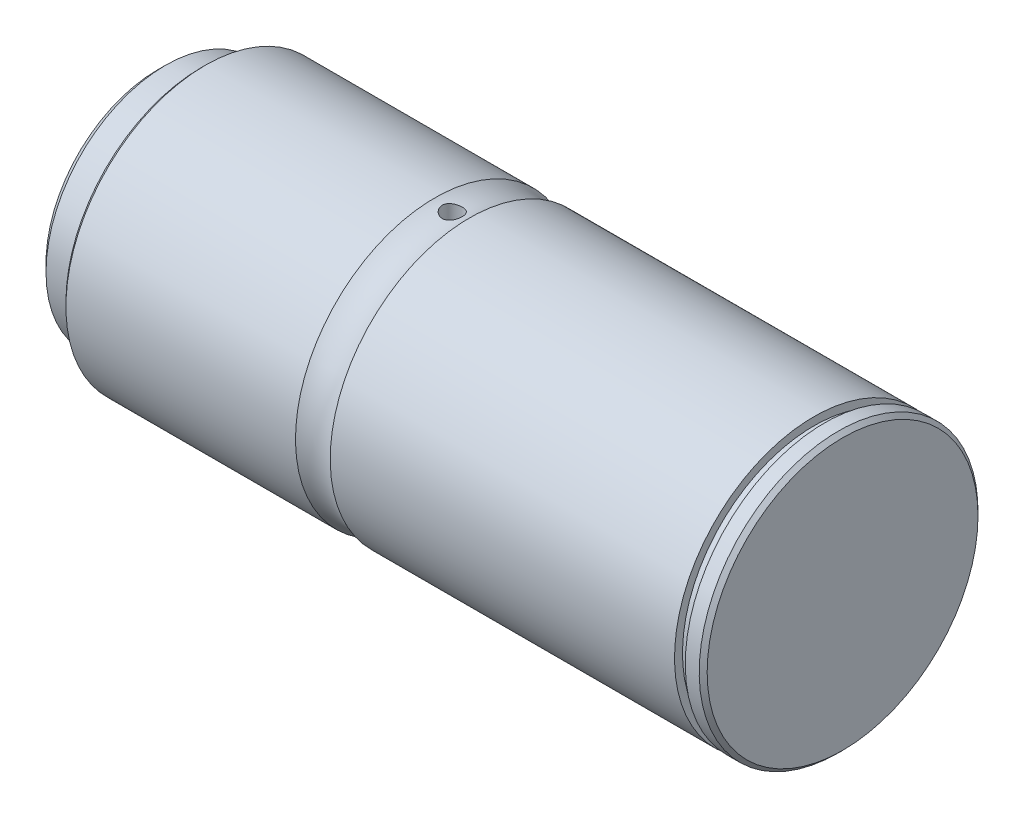
ISO-10303-21;
HEADER;
FILE_DESCRIPTION(('STEP AP214'),'2;1');
FILE_NAME('part.step','',(''),(''),'','','');
FILE_SCHEMA(('AUTOMOTIVE_DESIGN { 1 0 10303 214 1 1 1 1 }'));
ENDSEC;
DATA;
#1=APPLICATION_CONTEXT('core data for automotive mechanical design processes');
#2=APPLICATION_PROTOCOL_DEFINITION('international standard','automotive_design',2000,#1);
#3=PRODUCT_CONTEXT('',#1,'mechanical');
#4=PRODUCT('Part','Part','',(#3));
#5=PRODUCT_RELATED_PRODUCT_CATEGORY('part','',(#4));
#6=PRODUCT_DEFINITION_FORMATION('','',#4);
#7=PRODUCT_DEFINITION_CONTEXT('part definition',#1,'design');
#8=PRODUCT_DEFINITION('design','',#6,#7);
#9=PRODUCT_DEFINITION_SHAPE('','',#8);
#10=(LENGTH_UNIT() NAMED_UNIT(*) SI_UNIT(.MILLI.,.METRE.));
#11=(NAMED_UNIT(*) PLANE_ANGLE_UNIT() SI_UNIT($,.RADIAN.));
#12=(NAMED_UNIT(*) SI_UNIT($,.STERADIAN.) SOLID_ANGLE_UNIT());
#13=UNCERTAINTY_MEASURE_WITH_UNIT(LENGTH_MEASURE(1.E-05),#10,'distance_accuracy_value','');
#14=(GEOMETRIC_REPRESENTATION_CONTEXT(3) GLOBAL_UNCERTAINTY_ASSIGNED_CONTEXT((#13)) GLOBAL_UNIT_ASSIGNED_CONTEXT((#10,
#11,#12)) REPRESENTATION_CONTEXT('',''));
#15=CARTESIAN_POINT('',(0.,0.,0.));
#16=DIRECTION('',(0.,0.,1.));
#17=DIRECTION('',(1.,0.,0.));
#18=AXIS2_PLACEMENT_3D('',#15,#16,#17);
#19=CARTESIAN_POINT('',(74.,-50.,0.));
#20=DIRECTION('',(0.,1.,0.));
#21=DIRECTION('',(0.,0.,1.));
#22=AXIS2_PLACEMENT_3D('',#19,#20,#21);
#23=CYLINDRICAL_SURFACE('',#22,2.5);
#24=CARTESIAN_POINT('',(74.,-3.12249899919919,2.5));
#25=CARTESIAN_POINT('',(74.0621567514455,-3.1224999155542,2.49999941097139));
#26=CARTESIAN_POINT('',(74.1243259466708,-3.12436490733916,2.49767581942173));
#27=CARTESIAN_POINT('',(74.2481171795477,-3.13172923119025,2.48843349840856));
#28=CARTESIAN_POINT('',(74.3097388732571,-3.13723070381363,2.48151206248433));
#29=CARTESIAN_POINT('',(74.4932260477437,-3.15888953558504,2.45397595058365));
#30=CARTESIAN_POINT('',(74.6135483311889,-3.18020036271141,2.42658990946459));
#31=CARTESIAN_POINT('',(74.8455981978782,-3.23299770760366,2.35576217141197));
#32=CARTESIAN_POINT('',(74.957390415055,-3.26439575383208,2.31245961359202));
#33=CARTESIAN_POINT('',(75.172008525334,-3.33366000884438,2.21143916430899));
#34=CARTESIAN_POINT('',(75.274834173753,-3.37152639405533,2.15372087963018));
#35=CARTESIAN_POINT('',(75.4837339813036,-3.45559225121875,2.01647682425577));
#36=CARTESIAN_POINT('',(75.5883933250045,-3.50222814511577,1.93506425666948));
#37=CARTESIAN_POINT('',(75.7837615516238,-3.59505503533366,1.75662526657431));
#38=CARTESIAN_POINT('',(75.8744582799536,-3.64124561158437,1.65958538899782));
#39=CARTESIAN_POINT('',(76.0502202981726,-3.73459524771313,1.43833990582854));
#40=CARTESIAN_POINT('',(76.1332861844504,-3.78119887781503,1.31226934259652));
#41=CARTESIAN_POINT('',(76.2405451547362,-3.84307251838773,1.11163395543429));
#42=CARTESIAN_POINT('',(76.2734151383331,-3.8623628309205,1.04281240974104));
#43=CARTESIAN_POINT('',(76.3329546853632,-3.89770436975435,0.901758767615552));
#44=CARTESIAN_POINT('',(76.3596285310384,-3.91375783207116,0.829529068393799));
#45=CARTESIAN_POINT('',(76.4039838152562,-3.94066759113822,0.689700297916579));
#46=CARTESIAN_POINT('',(76.4223019765181,-3.95188535984465,0.622371981278594));
#47=CARTESIAN_POINT('',(76.4533022863133,-3.9709624190916,0.485997575898815));
#48=CARTESIAN_POINT('',(76.4659876892162,-3.9788236487972,0.416952503441689));
#49=CARTESIAN_POINT('',(76.4855137976345,-3.99095470334736,0.27776544985718));
#50=CARTESIAN_POINT('',(76.4923581165134,-3.99522674847833,0.207624174243912));
#51=CARTESIAN_POINT('',(76.5000992133892,-4.00006125072436,0.0669114466599455));
#52=CARTESIAN_POINT('',(76.5009966759633,-4.00062413482247,-0.0036599548602722));
#53=CARTESIAN_POINT('',(76.4952746264527,-3.99704479619502,-0.19604508155553));
#54=CARTESIAN_POINT('',(76.4826934969211,-3.98917040897435,-0.317681845488527));
#55=CARTESIAN_POINT('',(76.4402697820338,-3.9629090327593,-0.556636494620246));
#56=CARTESIAN_POINT('',(76.4104258920263,-3.94452124920476,-0.673954052677418));
#57=CARTESIAN_POINT('',(76.3347914407167,-3.89876170711608,-0.90177199176386));
#58=CARTESIAN_POINT('',(76.2889600804289,-3.87136697381046,-1.01225407159606));
#59=CARTESIAN_POINT('',(76.1830627610157,-3.80971291751353,-1.22404012071222));
#60=CARTESIAN_POINT('',(76.1229935589363,-3.77545203089317,-1.32534199174244));
#61=CARTESIAN_POINT('',(75.9819435830763,-3.69786441247166,-1.52942649744658));
#62=CARTESIAN_POINT('',(75.8992907233095,-3.6539400638152,-1.63082454612906));
#63=CARTESIAN_POINT('',(75.7197352627929,-3.56390927740506,-1.81919733573061));
#64=CARTESIAN_POINT('',(75.622811953616,-3.51779973570408,-1.90615071842623));
#65=CARTESIAN_POINT('',(75.4025887468265,-3.42142883464465,-2.07470887167908));
#66=CARTESIAN_POINT('',(75.2774972366419,-3.37141162686596,-2.15413229677843));
#67=CARTESIAN_POINT('',(75.0127077626986,-3.28028278192381,-2.29052307550563));
#68=CARTESIAN_POINT('',(74.8730373125469,-3.2391548038693,-2.34753179448503));
#69=CARTESIAN_POINT('',(74.6204611938937,-3.18183753131762,-2.42437133527931));
#70=CARTESIAN_POINT('',(74.5101780747865,-3.16193408602512,-2.45003683445404));
#71=CARTESIAN_POINT('',(74.2857696224401,-3.13358277759546,-2.4862033707309));
#72=CARTESIAN_POINT('',(74.1716497573431,-3.12511926504438,-2.49672512520811));
#73=CARTESIAN_POINT('',(73.9425426394975,-3.12092267030676,-2.5019707209518));
#74=CARTESIAN_POINT('',(73.8275539995215,-3.12521876170184,-2.49665835896694));
#75=CARTESIAN_POINT('',(73.6004388356815,-3.14592085836187,-2.47051466367814));
#76=CARTESIAN_POINT('',(73.4883147616288,-3.16233689222905,-2.44967047849126));
#77=CARTESIAN_POINT('',(73.2715632405743,-3.20460120797142,-2.39409874195038));
#78=CARTESIAN_POINT('',(73.1668426841056,-3.23028954367816,-2.35960571424757));
#79=CARTESIAN_POINT('',(72.9644253001062,-3.28831148388748,-2.27804893702243));
#80=CARTESIAN_POINT('',(72.866730981122,-3.3206474460208,-2.23098072583746));
#81=CARTESIAN_POINT('',(72.6613880583368,-3.39574401285202,-2.11530798730694));
#82=CARTESIAN_POINT('',(72.5553854726982,-3.43931724293014,-2.04430931160544));
#83=CARTESIAN_POINT('',(72.3556293393457,-3.52787943213337,-1.8873786892149));
#84=CARTESIAN_POINT('',(72.2618886787576,-3.57286982004466,-1.8014312490262));
#85=CARTESIAN_POINT('',(72.074035929359,-3.66766209459503,-1.60076932492121));
#86=CARTESIAN_POINT('',(71.9822726015151,-3.71707933883199,-1.48365201617177));
#87=CARTESIAN_POINT('',(71.8198529852802,-3.80768973398605,-1.2325678740781));
#88=CARTESIAN_POINT('',(71.749186804873,-3.84888673619007,-1.09860897940974));
#89=CARTESIAN_POINT('',(71.663418932025,-3.89988966499775,-0.891930804655093));
#90=CARTESIAN_POINT('',(71.6387025560487,-3.91477055097244,-0.824318196039432));
#91=CARTESIAN_POINT('',(71.5950617232677,-3.94124643918617,-0.686640792876433));
#92=CARTESIAN_POINT('',(71.576133913849,-3.95284334314804,-0.616577444051145));
#93=CARTESIAN_POINT('',(71.5443941698607,-3.97238512039949,-0.474639231464273));
#94=CARTESIAN_POINT('',(71.5315769004835,-3.98033317908835,-0.402766005755517));
#95=CARTESIAN_POINT('',(71.5122608277071,-3.99234168343342,-0.25788180714247));
#96=CARTESIAN_POINT('',(71.5057609790692,-3.99640277220023,-0.184871024482543));
#97=CARTESIAN_POINT('',(71.4969284844928,-4.00191521492705,0.0131102774248857));
#98=CARTESIAN_POINT('',(71.5007342070905,-3.99952706123946,0.138539079205443));
#99=CARTESIAN_POINT('',(71.5269175895455,-3.98321975018362,0.386583137102124));
#100=CARTESIAN_POINT('',(71.5492944066788,-3.96930111604856,0.509198520626822));
#101=CARTESIAN_POINT('',(71.6103224155461,-3.93192083384284,0.74408060548384));
#102=CARTESIAN_POINT('',(71.6483820735646,-3.90880701054802,0.8565587526318));
#103=CARTESIAN_POINT('',(71.7391194624434,-3.85489971248843,1.07343034721916));
#104=CARTESIAN_POINT('',(71.7917996595672,-3.82410494215308,1.17782242685801));
#105=CARTESIAN_POINT('',(71.9163212787199,-3.75350673935648,1.38731297754796));
#106=CARTESIAN_POINT('',(71.9895839907574,-3.71310001864656,1.49136012183779));
#107=CARTESIAN_POINT('',(72.1501532325141,-3.62867283985205,1.68643334934802));
#108=CARTESIAN_POINT('',(72.2374756088342,-3.58464833191202,1.7774445184368));
#109=CARTESIAN_POINT('',(72.4382325150618,-3.49000828219718,1.95744716561588));
#110=CARTESIAN_POINT('',(72.5536166125714,-3.43935738427103,2.04425661250062));
#111=CARTESIAN_POINT('',(72.7992894097597,-3.34349647457111,2.19754648509903));
#112=CARTESIAN_POINT('',(72.9295698111525,-3.29828346204189,2.26403815415027));
#113=CARTESIAN_POINT('',(73.1728053007848,-3.2285953978009,2.36198229412839));
#114=CARTESIAN_POINT('',(73.2832705721535,-3.20174639338769,2.39792458576828));
#115=CARTESIAN_POINT('',(73.5099393430017,-3.15878358104509,2.45425618419745));
#116=CARTESIAN_POINT('',(73.6261234197996,-3.14263581150428,2.47469472410167));
#117=CARTESIAN_POINT('',(73.786059994646,-3.12952857640606,2.49119847139521));
#118=CARTESIAN_POINT('',(73.8287255257086,-3.12689994306769,2.49449433837959));
#119=CARTESIAN_POINT('',(73.9142586989517,-3.12338461939861,2.49889558125806));
#120=CARTESIAN_POINT('',(73.9571263892433,-3.1224983671287,2.50000040629187));
#121=CARTESIAN_POINT('',(74.,-3.12249899919919,2.5));
#122=B_SPLINE_CURVE_WITH_KNOTS('',3,(#24,#25,#26,#27,#28,#29,#30,#31,#32,#33,#34,#35,#36,#37,
#38,#39,#40,#41,#42,#43,#44,#45,#46,#47,#48,#49,#50,#51,#52,#53,#54,#55,#56,#57,#58,#59,#60,#61,
#62,#63,#64,#65,#66,#67,#68,#69,#70,#71,#72,#73,#74,#75,#76,#77,#78,#79,#80,#81,#82,#83,#84,#85,
#86,#87,#88,#89,#90,#91,#92,#93,#94,#95,#96,#97,#98,#99,#100,#101,#102,#103,#104,#105,#106,#107,
#108,#109,#110,#111,#112,#113,#114,#115,#116,#117,#118,#119,#120,#121),.UNSPECIFIED.,.T.,.F.,(4,
2,2,2,2,2,2,2,2,2,2,2,2,2,2,2,2,2,2,2,2,2,2,2,2,2,2,2,2,2,2,2,2,2,2,2,2,2,2,2,2,2,2,2,2,2,2,2,
4),(0.,0.186415315858463,0.372940459994501,0.746478880764682,1.11682668423131,1.48718459072605,
1.9072279868507,2.32763499192879,2.79876029265969,3.03445880867313,3.26999394209508,
3.48170145743204,3.69328649746502,3.90474055342594,4.11617026725865,4.48184709708112,
4.84755156693917,5.21419620193003,5.58092442797433,5.99329080205305,6.40626158573463,
6.87316206383503,7.33919680735484,7.68265621505465,8.02564530559507,8.36941921026405,
8.71347788865088,9.05186495232122,9.39037223519198,9.79332737765185,10.1967026751544,
10.6647326786671,11.1325428866818,11.3527929661038,11.5729152387446,11.7928449800804,
12.0127383271001,12.3871595324234,12.7615637480925,13.1229788842094,13.4844550226785,
13.8834503840958,14.2828986410983,14.7399238503459,15.1966956936286,15.5530255473291,
15.9082190611886,16.0367696833384,16.1653526209168),.UNSPECIFIED.);
#123=CARTESIAN_POINT('',(74.,-3.12249899919919,2.5));
#124=VERTEX_POINT('',#123);
#125=EDGE_CURVE('E63',#124,#124,#122,.T.);
#126=ORIENTED_EDGE('',*,*,#125,.T.);
#127=EDGE_LOOP('',(#126));
#128=FACE_BOUND('',#127,.T.);
#129=CARTESIAN_POINT('',(71.940823442995,-34.1849235210543,-1.41767129726223));
#130=CARTESIAN_POINT('',(71.8634431418228,-34.2058805826897,-1.30527551884677));
#131=CARTESIAN_POINT('',(71.7951687295469,-34.225580796723,-1.18637508336717));
#132=CARTESIAN_POINT('',(71.678786699352,-34.2603220332909,-0.938459156775375));
#133=CARTESIAN_POINT('',(71.6306727859005,-34.2753645099168,-0.809446838268316));
#134=CARTESIAN_POINT('',(71.5561194983671,-34.2990838193437,-0.54444810997248));
#135=CARTESIAN_POINT('',(71.5297214943115,-34.3077484987955,-0.408448910781098));
#136=CARTESIAN_POINT('',(71.4997570804134,-34.3176059329933,-0.133691996290922));
#137=CARTESIAN_POINT('',(71.4961873586292,-34.318799771613,0.00506531592882345));
#138=CARTESIAN_POINT('',(71.5117801846965,-34.3136480270609,0.277117960326861));
#139=CARTESIAN_POINT('',(71.5302907774816,-34.3075186641582,0.410455481200277));
#140=CARTESIAN_POINT('',(71.5882872329639,-34.2887943794797,0.672004384500487));
#141=CARTESIAN_POINT('',(71.6277748044661,-34.2761989309731,0.800215348397945));
#142=CARTESIAN_POINT('',(71.7268171084698,-34.2458237412776,1.04915885339694));
#143=CARTESIAN_POINT('',(71.7865303531189,-34.2280032031401,1.16982311533729));
#144=CARTESIAN_POINT('',(71.9242145447561,-34.1891201729517,1.39966918357731));
#145=CARTESIAN_POINT('',(72.0021901413643,-34.1680568557534,1.508848055405));
#146=CARTESIAN_POINT('',(72.1784212752687,-34.1238318897247,1.71796283590963));
#147=CARTESIAN_POINT('',(72.2774463528336,-34.1006182676198,1.81724010023527));
#148=CARTESIAN_POINT('',(72.4908638422821,-34.0555020460948,1.99801624839782));
#149=CARTESIAN_POINT('',(72.6052584249177,-34.0335996324995,2.07951261662972));
#150=CARTESIAN_POINT('',(72.8485134457488,-33.9931814580314,2.22359405666598));
#151=CARTESIAN_POINT('',(72.9775755791976,-33.9747253116531,2.28585662691007));
#152=CARTESIAN_POINT('',(73.2450635968843,-33.9438082609082,2.38757771105095));
#153=CARTESIAN_POINT('',(73.383486546089,-33.9313454872023,2.42704333611327));
#154=CARTESIAN_POINT('',(73.6602152644457,-33.9142586904159,2.48065700856463));
#155=CARTESIAN_POINT('',(73.7983306198943,-33.9093581386343,2.49569929471694));
#156=CARTESIAN_POINT('',(74.0751933348262,-33.9070881264317,2.50270083063866));
#157=CARTESIAN_POINT('',(74.2139405656136,-33.9097171954049,2.49466458786083));
#158=CARTESIAN_POINT('',(74.4834391642696,-33.9219897105237,2.45646463898645));
#159=CARTESIAN_POINT('',(74.6143041823496,-33.9314048919099,2.42702074782228));
#160=CARTESIAN_POINT('',(74.8691654986107,-33.9559750628083,2.34784236090644));
#161=CARTESIAN_POINT('',(74.9931610152722,-33.9711307038621,2.29810556186185));
#162=CARTESIAN_POINT('',(75.2337188039265,-34.0059800813899,2.17861358306927));
#163=CARTESIAN_POINT('',(75.3500686467133,-34.0257629422873,2.10845761616215));
#164=CARTESIAN_POINT('',(75.5696552771735,-34.0676366836764,1.9505092738151));
#165=CARTESIAN_POINT('',(75.6728884222917,-34.0897282022002,1.86271201672171));
#166=CARTESIAN_POINT('',(75.8680346827009,-34.1349516448623,1.66742935474684));
#167=CARTESIAN_POINT('',(75.9592543622214,-34.1580867763191,1.5592502950632));
#168=CARTESIAN_POINT('',(76.1223685192125,-34.2018576747393,1.32871692318024));
#169=CARTESIAN_POINT('',(76.1942622681476,-34.2224933474637,1.20636207684077));
#170=CARTESIAN_POINT('',(76.3166699365536,-34.2589057951675,0.950369407165823));
#171=CARTESIAN_POINT('',(76.3671401441917,-34.2746726182372,0.816709176376441));
#172=CARTESIAN_POINT('',(76.4446633506037,-34.2993289786515,0.54216798516539));
#173=CARTESIAN_POINT('',(76.4717251692881,-34.3082211061383,0.401289765578736));
#174=CARTESIAN_POINT('',(76.5007073169468,-34.3177621926055,0.123072162795667));
#175=CARTESIAN_POINT('',(76.5036959731273,-34.3187613866967,-0.01414448652062));
#176=CARTESIAN_POINT('',(76.4872233029296,-34.3133185731213,-0.287061059030863));
#177=CARTESIAN_POINT('',(76.467764209684,-34.3068773056419,-0.42276113174004));
#178=CARTESIAN_POINT('',(76.4077866805146,-34.2875412512105,-0.685846797856871));
#179=CARTESIAN_POINT('',(76.3677261515809,-34.2747870047359,-0.813347983397815));
#180=CARTESIAN_POINT('',(76.2681239326774,-34.2443075153071,-1.05985622313542));
#181=CARTESIAN_POINT('',(76.2085786740258,-34.2265813618194,-1.1788617164552));
#182=CARTESIAN_POINT('',(76.0693066251063,-34.1873351903808,-1.40951974393985));
#183=CARTESIAN_POINT('',(75.9889507135088,-34.165704786156,-1.5207733310437));
#184=CARTESIAN_POINT('',(75.8112763513427,-34.1213930895067,-1.72857649009956));
#185=CARTESIAN_POINT('',(75.7139534042133,-34.0987115196776,-1.82512215145279));
#186=CARTESIAN_POINT('',(75.5006091772281,-34.0537972185015,-2.0045795112492));
#187=CARTESIAN_POINT('',(75.3840102382058,-34.0316157863691,-2.08681937050215));
#188=CARTESIAN_POINT('',(75.1380129974923,-33.9911656633744,-2.23051763283554));
#189=CARTESIAN_POINT('',(75.0086161293808,-33.9728965349933,-2.29197836012236));
#190=CARTESIAN_POINT('',(74.7425705422559,-33.9426335190746,-2.39132708901445));
#191=CARTESIAN_POINT('',(74.6060582430336,-33.9305503722955,-2.42955197402147));
#192=CARTESIAN_POINT('',(74.3281144273815,-33.9136968587466,-2.48240501191707));
#193=CARTESIAN_POINT('',(74.1866845492948,-33.9089240798779,-2.49704094820124));
#194=CARTESIAN_POINT('',(73.9096427109963,-33.9073030455006,-2.50203493132806));
#195=CARTESIAN_POINT('',(73.7740504710854,-33.9101132126627,-2.49343942107739));
#196=CARTESIAN_POINT('',(73.5063652234926,-33.9226153538975,-2.45450949008857));
#197=CARTESIAN_POINT('',(73.3742720816567,-33.9323070637374,-2.42417590403454));
#198=CARTESIAN_POINT('',(73.1179825335964,-33.957432616114,-2.34307743431935));
#199=CARTESIAN_POINT('',(72.9937444458723,-33.972832529826,-2.29243313198174));
#200=CARTESIAN_POINT('',(72.7553809544655,-34.0077776478469,-2.17226882271116));
#201=CARTESIAN_POINT('',(72.6412589340029,-34.0273242316083,-2.10274253223689));
#202=CARTESIAN_POINT('',(72.4183512403466,-34.0700288144433,-1.94128899467672));
#203=CARTESIAN_POINT('',(72.3104715813844,-34.0933426985463,-1.84815046372673));
#204=CARTESIAN_POINT('',(72.1120368424968,-34.139867445949,-1.6449218262739));
#205=CARTESIAN_POINT('',(72.0214831142175,-34.1630783010733,-1.53483039843472));
#206=CARTESIAN_POINT('',(71.940823442995,-34.1849235210543,-1.41767129726223));
#207=B_SPLINE_CURVE_WITH_KNOTS('',3,(#129,#130,#131,#132,#133,#134,#135,#136,#137,#138,#139,
#140,#141,#142,#143,#144,#145,#146,#147,#148,#149,#150,#151,#152,#153,#154,#155,#156,#157,#158,
#159,#160,#161,#162,#163,#164,#165,#166,#167,#168,#169,#170,#171,#172,#173,#174,#175,#176,#177,
#178,#179,#180,#181,#182,#183,#184,#185,#186,#187,#188,#189,#190,#191,#192,#193,#194,#195,#196,
#197,#198,#199,#200,#201,#202,#203,#204,#205,#206),.UNSPECIFIED.,.T.,.F.,(4,2,2,2,2,2,2,2,2,2,2,
2,2,2,2,2,2,2,2,2,2,2,2,2,2,2,2,2,2,2,2,2,2,2,2,2,2,2,4),(0.,0.413695098707151,0.82726091611782,
1.24161278691581,1.6559045419164,2.05826052745796,2.46064929433504,2.86626756660566,
3.27198922232986,3.69642548093478,4.12092174903602,4.55219136707334,4.98332638426558,
5.39828751052621,5.81316759650623,6.21470726234715,6.61629251657141,7.02636338168082,
7.43654787722964,7.86468982876647,8.29284791783648,8.72187545453353,9.15074126994388,
9.56046368553082,9.97014534489181,10.3710911534707,10.7721104375168,11.1870580863652,
11.6021158712234,12.0332287097164,12.4642933110179,12.8889490328172,13.3134646067582,
13.7191805084427,14.1248808325539,14.5282074166542,14.9316683844452,15.3628622184306,
15.7940896773912),.UNSPECIFIED.);
#208=CARTESIAN_POINT('',(71.940823442995,-34.1849235210543,-1.41767129726223));
#209=VERTEX_POINT('',#208);
#210=EDGE_CURVE('E81',#209,#209,#207,.T.);
#211=ORIENTED_EDGE('',*,*,#210,.F.);
#212=EDGE_LOOP('',(#211));
#213=FACE_BOUND('',#212,.T.);
#214=ADVANCED_FACE('F38',(#128,#213),#23,.F.);
#215=CARTESIAN_POINT('',(0.,0.,0.));
#216=DIRECTION('',(1.,0.,0.));
#217=DIRECTION('',(0.,1.,0.));
#218=AXIS2_PLACEMENT_3D('',#215,#216,#217);
#219=PLANE('',#218);
#220=CARTESIAN_POINT('',(0.,0.,0.));
#221=DIRECTION('',(-1.,0.,0.));
#222=DIRECTION('',(0.,-1.,0.));
#223=AXIS2_PLACEMENT_3D('',#220,#221,#222);
#224=CIRCLE('',#223,15.);
#225=CARTESIAN_POINT('',(0.,-15.,0.));
#226=VERTEX_POINT('',#225);
#227=EDGE_CURVE('E74',#226,#226,#224,.T.);
#228=ORIENTED_EDGE('',*,*,#227,.F.);
#229=EDGE_LOOP('',(#228));
#230=FACE_BOUND('',#229,.T.);
#231=CARTESIAN_POINT('',(0.,0.,0.));
#232=DIRECTION('',(1.,0.,0.));
#233=DIRECTION('',(0.,1.,0.));
#234=AXIS2_PLACEMENT_3D('',#231,#232,#233);
#235=CIRCLE('',#234,28.);
#236=CARTESIAN_POINT('',(0.,28.,0.));
#237=VERTEX_POINT('',#236);
#238=EDGE_CURVE('E99',#237,#237,#235,.F.);
#239=ORIENTED_EDGE('',*,*,#238,.T.);
#240=EDGE_LOOP('',(#239));
#241=FACE_BOUND('',#240,.T.);
#242=ADVANCED_FACE('F153',(#230,#241),#219,.F.);
#243=CARTESIAN_POINT('',(172.,35.,0.));
#244=DIRECTION('',(-1.,0.,0.));
#245=DIRECTION('',(0.,-1.,0.));
#246=AXIS2_PLACEMENT_3D('',#243,#244,#245);
#247=PLANE('',#246);
#248=CARTESIAN_POINT('',(172.,0.,0.));
#249=DIRECTION('',(-1.,0.,0.));
#250=DIRECTION('',(0.,-1.,0.));
#251=AXIS2_PLACEMENT_3D('',#248,#249,#250);
#252=CIRCLE('',#251,33.9999999999999);
#253=CARTESIAN_POINT('',(172.,-33.9999999999999,0.));
#254=VERTEX_POINT('',#253);
#255=EDGE_CURVE('E11',#254,#254,#252,.F.);
#256=ORIENTED_EDGE('',*,*,#255,.T.);
#257=EDGE_LOOP('',(#256));
#258=FACE_BOUND('',#257,.T.);
#259=ADVANCED_FACE('F158',(#258),#247,.F.);
#260=CARTESIAN_POINT('',(0.,0.,0.));
#261=DIRECTION('',(-1.,0.,0.));
#262=DIRECTION('',(0.,-1.,0.));
#263=AXIS2_PLACEMENT_3D('',#260,#261,#262);
#264=CYLINDRICAL_SURFACE('',#263,35.);
#265=CARTESIAN_POINT('',(171.,0.,0.));
#266=DIRECTION('',(-1.,0.,0.));
#267=DIRECTION('',(0.,-1.,0.));
#268=AXIS2_PLACEMENT_3D('',#265,#266,#267);
#269=CIRCLE('',#268,35.);
#270=CARTESIAN_POINT('',(171.,-35.,0.));
#271=VERTEX_POINT('',#270);
#272=EDGE_CURVE('E46',#271,#271,#269,.T.);
#273=ORIENTED_EDGE('',*,*,#272,.T.);
#274=EDGE_LOOP('',(#273));
#275=FACE_BOUND('',#274,.T.);
#276=CARTESIAN_POINT('',(167.5,0.,0.));
#277=DIRECTION('',(-1.,0.,0.));
#278=DIRECTION('',(0.,-1.,0.));
#279=AXIS2_PLACEMENT_3D('',#276,#277,#278);
#280=CIRCLE('',#279,35.);
#281=CARTESIAN_POINT('',(167.5,-35.,0.));
#282=VERTEX_POINT('',#281);
#283=EDGE_CURVE('E96',#282,#282,#280,.T.);
#284=ORIENTED_EDGE('',*,*,#283,.F.);
#285=EDGE_LOOP('',(#284));
#286=FACE_BOUND('',#285,.T.);
#287=ADVANCED_FACE('F196',(#275,#286),#264,.T.);
#288=CARTESIAN_POINT('',(167.5,33.,0.));
#289=DIRECTION('',(1.,0.,0.));
#290=DIRECTION('',(0.,1.,0.));
#291=AXIS2_PLACEMENT_3D('',#288,#289,#290);
#292=PLANE('',#291);
#293=CARTESIAN_POINT('',(167.5,0.,0.));
#294=DIRECTION('',(-1.,0.,0.));
#295=DIRECTION('',(0.,-1.,0.));
#296=AXIS2_PLACEMENT_3D('',#293,#294,#295);
#297=CIRCLE('',#296,33.);
#298=CARTESIAN_POINT('',(167.5,-33.,0.));
#299=VERTEX_POINT('',#298);
#300=EDGE_CURVE('E93',#299,#299,#297,.T.);
#301=ORIENTED_EDGE('',*,*,#300,.F.);
#302=EDGE_LOOP('',(#301));
#303=FACE_BOUND('',#302,.T.);
#304=ORIENTED_EDGE('',*,*,#283,.T.);
#305=EDGE_LOOP('',(#304));
#306=FACE_BOUND('',#305,.T.);
#307=ADVANCED_FACE('F190',(#303,#306),#292,.F.);
#308=CARTESIAN_POINT('',(0.,0.,0.));
#309=DIRECTION('',(-1.,0.,0.));
#310=DIRECTION('',(0.,-1.,0.));
#311=AXIS2_PLACEMENT_3D('',#308,#309,#310);
#312=CYLINDRICAL_SURFACE('',#311,33.);
#313=CARTESIAN_POINT('',(164.8,0.,0.));
#314=DIRECTION('',(-1.,0.,0.));
#315=DIRECTION('',(0.,-1.,0.));
#316=AXIS2_PLACEMENT_3D('',#313,#314,#315);
#317=CIRCLE('',#316,33.);
#318=CARTESIAN_POINT('',(164.8,-33.,0.));
#319=VERTEX_POINT('',#318);
#320=EDGE_CURVE('E90',#319,#319,#317,.T.);
#321=ORIENTED_EDGE('',*,*,#320,.F.);
#322=EDGE_LOOP('',(#321));
#323=FACE_BOUND('',#322,.T.);
#324=ORIENTED_EDGE('',*,*,#300,.T.);
#325=EDGE_LOOP('',(#324));
#326=FACE_BOUND('',#325,.T.);
#327=ADVANCED_FACE('F184',(#323,#326),#312,.T.);
#328=CARTESIAN_POINT('',(164.8,35.,0.));
#329=DIRECTION('',(-1.,0.,0.));
#330=DIRECTION('',(0.,-1.,0.));
#331=AXIS2_PLACEMENT_3D('',#328,#329,#330);
#332=PLANE('',#331);
#333=CARTESIAN_POINT('',(164.8,0.,0.));
#334=DIRECTION('',(-1.,0.,0.));
#335=DIRECTION('',(0.,-1.,0.));
#336=AXIS2_PLACEMENT_3D('',#333,#334,#335);
#337=CIRCLE('',#336,35.);
#338=CARTESIAN_POINT('',(164.8,-35.,0.));
#339=VERTEX_POINT('',#338);
#340=EDGE_CURVE('E87',#339,#339,#337,.T.);
#341=ORIENTED_EDGE('',*,*,#340,.F.);
#342=EDGE_LOOP('',(#341));
#343=FACE_BOUND('',#342,.T.);
#344=ORIENTED_EDGE('',*,*,#320,.T.);
#345=EDGE_LOOP('',(#344));
#346=FACE_BOUND('',#345,.T.);
#347=ADVANCED_FACE('F179',(#343,#346),#332,.F.);
#348=CARTESIAN_POINT('',(0.,0.,0.));
#349=DIRECTION('',(-1.,0.,0.));
#350=DIRECTION('',(0.,-1.,0.));
#351=AXIS2_PLACEMENT_3D('',#348,#349,#350);
#352=CYLINDRICAL_SURFACE('',#351,35.);
#353=CARTESIAN_POINT('',(78.3588989435407,0.,0.));
#354=DIRECTION('',(-1.,0.,0.));
#355=DIRECTION('',(0.,-1.,0.));
#356=AXIS2_PLACEMENT_3D('',#353,#354,#355);
#357=CIRCLE('',#356,35.);
#358=CARTESIAN_POINT('',(78.3588989435407,-35.,0.));
#359=VERTEX_POINT('',#358);
#360=EDGE_CURVE('E84',#359,#359,#357,.T.);
#361=ORIENTED_EDGE('',*,*,#360,.F.);
#362=EDGE_LOOP('',(#361));
#363=FACE_BOUND('',#362,.T.);
#364=ORIENTED_EDGE('',*,*,#340,.T.);
#365=EDGE_LOOP('',(#364));
#366=FACE_BOUND('',#365,.T.);
#367=ADVANCED_FACE('F170',(#363,#366),#352,.T.);
#368=CARTESIAN_POINT('',(74.,0.,0.));
#369=DIRECTION('',(-1.,0.,0.));
#370=DIRECTION('',(0.,-1.,0.));
#371=AXIS2_PLACEMENT_3D('',#368,#369,#370);
#372=TOROIDAL_SURFACE('',#371,44.,10.);
#373=ORIENTED_EDGE('',*,*,#210,.T.);
#374=EDGE_LOOP('',(#373));
#375=FACE_BOUND('',#374,.T.);
#376=CARTESIAN_POINT('',(71.940823442995,34.1849235210543,-1.41767129726223));
#377=CARTESIAN_POINT('',(72.0211798620094,34.1631603397487,-1.5343868189071));
#378=CARTESIAN_POINT('',(72.1113683078781,34.1400391645456,-1.64410617796501));
#379=CARTESIAN_POINT('',(72.3089872419927,34.09367593114,-1.84675984926389));
#380=CARTESIAN_POINT('',(72.4164247029696,34.0704338277456,-1.93968734114448));
#381=CARTESIAN_POINT('',(72.6459034045639,34.0263992721853,-2.10630868616117));
#382=CARTESIAN_POINT('',(72.7679555993135,34.0056086809516,-2.17998797898744));
#383=CARTESIAN_POINT('',(73.0233835725031,33.968870695687,-2.30574689445653));
#384=CARTESIAN_POINT('',(73.1567556176152,33.952921712757,-2.35783360532014));
#385=CARTESIAN_POINT('',(73.4280485698717,33.9280273438572,-2.43770918195832));
#386=CARTESIAN_POINT('',(73.5658072522708,33.9189370564819,-2.46600229774831));
#387=CARTESIAN_POINT('',(73.8443947404553,33.9082766885858,-2.49908967689252));
#388=CARTESIAN_POINT('',(73.9852227668942,33.9067047209066,-2.50388983717371));
#389=CARTESIAN_POINT('',(74.2597788665864,33.9111689253825,-2.49010721424452));
#390=CARTESIAN_POINT('',(74.3935610990445,33.9168954587869,-2.47247613076226));
#391=CARTESIAN_POINT('',(74.6561383122281,33.934792555662,-2.41609535243374));
#392=CARTESIAN_POINT('',(74.7849330941834,33.9469633756809,-2.37734481681658));
#393=CARTESIAN_POINT('',(75.0348958021837,33.9765384725749,-2.27971686630455));
#394=CARTESIAN_POINT('',(75.1560126409639,33.9939740940063,-2.22071860888457));
#395=CARTESIAN_POINT('',(75.3868493334818,34.0322485418232,-2.08437755543112));
#396=CARTESIAN_POINT('',(75.4965663365382,34.0530882161027,-2.00703018675681));
#397=CARTESIAN_POINT('',(75.7066364509525,34.0970359676166,-1.83217890524096));
#398=CARTESIAN_POINT('',(75.8063629309884,34.120203559101,-1.73393630120202));
#399=CARTESIAN_POINT('',(75.9881757624129,34.1654766835579,-1.52205450122883));
#400=CARTESIAN_POINT('',(76.0702591601427,34.1875820382192,-1.40841273247787));
#401=CARTESIAN_POINT('',(76.2158497268305,34.2286530405853,-1.16632547673098));
#402=CARTESIAN_POINT('',(76.2789896591602,34.2475538648856,-1.03764723649681));
#403=CARTESIAN_POINT('',(76.3825198134886,34.279415688609,-0.770757985431697));
#404=CARTESIAN_POINT('',(76.4229174071086,34.292378612468,-0.632550079836226));
#405=CARTESIAN_POINT('',(76.4783930557265,34.310369523158,-0.355976055837184));
#406=CARTESIAN_POINT('',(76.4943522496243,34.3156732377948,-0.217804821368707));
#407=CARTESIAN_POINT('',(76.5031359268749,34.3185787150315,0.0593373815264712));
#408=CARTESIAN_POINT('',(76.4959653216858,34.3161821127427,0.19830817391692));
#409=CARTESIAN_POINT('',(76.4594414158698,34.304207199419,0.468000033691487));
#410=CARTESIAN_POINT('',(76.4308707779896,34.2948823690185,0.598839764453346));
#411=CARTESIAN_POINT('',(76.3534629812064,34.2704073141432,0.85379593737937));
#412=CARTESIAN_POINT('',(76.3046232755849,34.2552563576592,0.977911532469401));
#413=CARTESIAN_POINT('',(76.1869219180423,34.2203879756086,1.21891118906826));
#414=CARTESIAN_POINT('',(76.1176522985433,34.2005793587832,1.33558234975508));
#415=CARTESIAN_POINT('',(75.9614313492046,34.1586838756203,1.55597027819434));
#416=CARTESIAN_POINT('',(75.8744751536697,34.1365963831746,1.65968346842063));
#417=CARTESIAN_POINT('',(75.6806971244603,34.0913965431176,1.85610759292309));
#418=CARTESIAN_POINT('',(75.5731548886287,34.0682830082353,1.94810911382445));
#419=CARTESIAN_POINT('',(75.3437518162341,34.0245796166602,2.1128827939561));
#420=CARTESIAN_POINT('',(75.2218905218203,34.0039898407075,2.18565433806747));
#421=CARTESIAN_POINT('',(74.9667702069363,33.9676257115543,2.30987280006529));
#422=CARTESIAN_POINT('',(74.8334912710644,33.951860001087,2.36128150286324));
#423=CARTESIAN_POINT('',(74.5595554993804,33.9270684684117,2.44074106130995));
#424=CARTESIAN_POINT('',(74.4189012561107,33.9180402946226,2.46880006702387));
#425=CARTESIAN_POINT('',(74.1407447063659,33.9080476279662,2.49978465572034));
#426=CARTESIAN_POINT('',(74.003368981201,33.9067514302795,2.50374426921878));
#427=CARTESIAN_POINT('',(73.7299607947085,33.9114829261653,2.48913936577198));
#428=CARTESIAN_POINT('',(73.5939281875182,33.9175098154312,2.47057732241769));
#429=CARTESIAN_POINT('',(73.3300009095777,33.935998184188,2.41225784899017));
#430=CARTESIAN_POINT('',(73.2019950997551,33.9483212337733,2.37295582941961));
#431=CARTESIAN_POINT('',(72.9543787930362,33.9780162059103,2.27473636988479));
#432=CARTESIAN_POINT('',(72.8347696833801,33.9953889603107,2.21581569786458));
#433=CARTESIAN_POINT('',(72.6031528525567,34.0340316958789,2.07787468271558));
#434=CARTESIAN_POINT('',(72.4915095827402,34.0554083659514,1.99827284845766));
#435=CARTESIAN_POINT('',(72.2828194862059,34.099440710967,1.82207360829647));
#436=CARTESIAN_POINT('',(72.1857766935959,34.1220967370265,1.72547152116584));
#437=CARTESIAN_POINT('',(72.0051593861144,34.1672072962255,1.51351905399741));
#438=CARTESIAN_POINT('',(71.9222583405026,34.1896194547613,1.39758410031168));
#439=CARTESIAN_POINT('',(71.7771108391065,34.2307210333075,1.15282264138774));
#440=CARTESIAN_POINT('',(71.7148623628203,34.2494108174174,1.02399739885071));
#441=CARTESIAN_POINT('',(71.6137036361964,34.2806167228076,0.758615203631349));
#442=CARTESIAN_POINT('',(71.5745126562025,34.2932067613909,0.622174387312605));
#443=CARTESIAN_POINT('',(71.5197588987571,34.3109745764564,0.344173600780068));
#444=CARTESIAN_POINT('',(71.5041882638753,34.3161548178133,0.202615348958192));
#445=CARTESIAN_POINT('',(71.4974470278364,34.3183871508172,-0.0745835140276577));
#446=CARTESIAN_POINT('',(71.5051840707473,34.315803142701,-0.210195899288693));
#447=CARTESIAN_POINT('',(71.5424105716619,34.3036021671164,-0.47804909752442));
#448=CARTESIAN_POINT('',(71.571896323095,34.2939863980534,-0.610290481036765));
#449=CARTESIAN_POINT('',(71.6491685521062,34.2695969365295,-0.860030053930722));
#450=CARTESIAN_POINT('',(71.6957542847906,34.2551663399218,-0.977936940428646));
#451=CARTESIAN_POINT('',(71.8059162796053,34.2224889245293,-1.20495845159007));
#452=CARTESIAN_POINT('',(71.8694965888084,34.2042411969619,-1.31407097390569));
#453=CARTESIAN_POINT('',(71.940823442995,34.1849235210543,-1.41767129726223));
#454=B_SPLINE_CURVE_WITH_KNOTS('',3,(#376,#377,#378,#379,#380,#381,#382,#383,#384,#385,#386,
#387,#388,#389,#390,#391,#392,#393,#394,#395,#396,#397,#398,#399,#400,#401,#402,#403,#404,#405,
#406,#407,#408,#409,#410,#411,#412,#413,#414,#415,#416,#417,#418,#419,#420,#421,#422,#423,#424,
#425,#426,#427,#428,#429,#430,#431,#432,#433,#434,#435,#436,#437,#438,#439,#440,#441,#442,#443,
#444,#445,#446,#447,#448,#449,#450,#451,#452,#453),.UNSPECIFIED.,.T.,.F.,(4,2,2,2,2,2,2,2,2,2,2,
2,2,2,2,2,2,2,2,2,2,2,2,2,2,2,2,2,2,2,2,2,2,2,2,2,2,2,4),(0.,0.429636586962088,0.85944728927411,
1.28958218677962,1.71957577139893,2.14020895129932,2.5607365433606,2.96400296569494,
3.36728544334357,3.77301789992311,4.17885157237562,4.60258900931361,5.02639732970929,
5.4579574681978,5.8893776416439,6.30484260474154,6.7202193524421,7.12110397828316,
7.52203898876058,7.93159571017478,8.34126525614566,8.76945631245817,9.19766106387519,
9.62662854914776,10.0554462431357,10.4657270878205,10.8759628747581,11.2775441082155,
11.6791915325456,12.0936581438532,12.5082390626969,12.9390005453205,13.3697198728357,
13.7950803541025,14.2202993059455,14.6259044569138,15.0314404977168,15.4127084052841,
15.7940671886557),.UNSPECIFIED.);
#455=CARTESIAN_POINT('',(71.940823442995,34.1849235210543,-1.41767129726223));
#456=VERTEX_POINT('',#455);
#457=EDGE_CURVE('E73',#456,#456,#454,.T.);
#458=ORIENTED_EDGE('',*,*,#457,.T.);
#459=EDGE_LOOP('',(#458));
#460=FACE_BOUND('',#459,.T.);
#461=CARTESIAN_POINT('',(69.6411010564593,0.,0.));
#462=DIRECTION('',(-1.,0.,0.));
#463=DIRECTION('',(0.,-1.,0.));
#464=AXIS2_PLACEMENT_3D('',#461,#462,#463);
#465=CIRCLE('',#464,35.);
#466=CARTESIAN_POINT('',(69.6411010564593,-35.,0.));
#467=VERTEX_POINT('',#466);
#468=EDGE_CURVE('E80',#467,#467,#465,.T.);
#469=ORIENTED_EDGE('',*,*,#468,.F.);
#470=EDGE_LOOP('',(#469));
#471=FACE_BOUND('',#470,.T.);
#472=ORIENTED_EDGE('',*,*,#360,.T.);
#473=EDGE_LOOP('',(#472));
#474=FACE_BOUND('',#473,.T.);
#475=ADVANCED_FACE('F111',(#375,#460,#471,#474),#372,.F.);
#476=CARTESIAN_POINT('',(0.,0.,0.));
#477=DIRECTION('',(-1.,0.,0.));
#478=DIRECTION('',(0.,-1.,0.));
#479=AXIS2_PLACEMENT_3D('',#476,#477,#478);
#480=CYLINDRICAL_SURFACE('',#479,35.);
#481=CARTESIAN_POINT('',(12.,0.,0.));
#482=DIRECTION('',(1.,0.,0.));
#483=DIRECTION('',(0.,1.,0.));
#484=AXIS2_PLACEMENT_3D('',#481,#482,#483);
#485=CIRCLE('',#484,35.);
#486=CARTESIAN_POINT('',(12.,35.,0.));
#487=VERTEX_POINT('',#486);
#488=EDGE_CURVE('E222',#487,#487,#485,.T.);
#489=ORIENTED_EDGE('',*,*,#488,.T.);
#490=EDGE_LOOP('',(#489));
#491=FACE_BOUND('',#490,.T.);
#492=ORIENTED_EDGE('',*,*,#468,.T.);
#493=EDGE_LOOP('',(#492));
#494=FACE_BOUND('',#493,.T.);
#495=ADVANCED_FACE('F169',(#491,#494),#480,.T.);
#496=CARTESIAN_POINT('',(11.,30.,0.));
#497=DIRECTION('',(1.,0.,0.));
#498=DIRECTION('',(0.,1.,0.));
#499=AXIS2_PLACEMENT_3D('',#496,#497,#498);
#500=PLANE('',#499);
#501=CARTESIAN_POINT('',(11.,0.,0.));
#502=DIRECTION('',(1.,0.,0.));
#503=DIRECTION('',(0.,1.,0.));
#504=AXIS2_PLACEMENT_3D('',#501,#502,#503);
#505=CIRCLE('',#504,34.);
#506=CARTESIAN_POINT('',(11.,34.,0.));
#507=VERTEX_POINT('',#506);
#508=EDGE_CURVE('E225',#507,#507,#505,.F.);
#509=ORIENTED_EDGE('',*,*,#508,.T.);
#510=EDGE_LOOP('',(#509));
#511=FACE_BOUND('',#510,.T.);
#512=CARTESIAN_POINT('',(11.,0.,0.));
#513=DIRECTION('',(-1.,0.,0.));
#514=DIRECTION('',(0.,-1.,0.));
#515=AXIS2_PLACEMENT_3D('',#512,#513,#514);
#516=CIRCLE('',#515,30.);
#517=CARTESIAN_POINT('',(11.,-30.,0.));
#518=VERTEX_POINT('',#517);
#519=EDGE_CURVE('E77',#518,#518,#516,.T.);
#520=ORIENTED_EDGE('',*,*,#519,.F.);
#521=EDGE_LOOP('',(#520));
#522=FACE_BOUND('',#521,.T.);
#523=ADVANCED_FACE('F242',(#511,#522),#500,.F.);
#524=CARTESIAN_POINT('',(0.,0.,0.));
#525=DIRECTION('',(-1.,0.,0.));
#526=DIRECTION('',(0.,-1.,0.));
#527=AXIS2_PLACEMENT_3D('',#524,#525,#526);
#528=CYLINDRICAL_SURFACE('',#527,30.);
#529=CARTESIAN_POINT('',(1.99999999999998,0.,0.));
#530=DIRECTION('',(1.,0.,0.));
#531=DIRECTION('',(0.,1.,0.));
#532=AXIS2_PLACEMENT_3D('',#529,#530,#531);
#533=CIRCLE('',#532,30.);
#534=CARTESIAN_POINT('',(1.99999999999997,30.,0.));
#535=VERTEX_POINT('',#534);
#536=EDGE_CURVE('E227',#535,#535,#533,.T.);
#537=ORIENTED_EDGE('',*,*,#536,.T.);
#538=EDGE_LOOP('',(#537));
#539=FACE_BOUND('',#538,.T.);
#540=ORIENTED_EDGE('',*,*,#519,.T.);
#541=EDGE_LOOP('',(#540));
#542=FACE_BOUND('',#541,.T.);
#543=ADVANCED_FACE('F121',(#539,#542),#528,.T.);
#544=CARTESIAN_POINT('',(74.,3.12249899919919,2.5));
#545=CARTESIAN_POINT('',(73.9378432485544,3.1224999155542,2.49999941097139));
#546=CARTESIAN_POINT('',(73.8756740533292,3.12436490733916,2.49767581942173));
#547=CARTESIAN_POINT('',(73.7518828204522,3.13172923119025,2.48843349840856));
#548=CARTESIAN_POINT('',(73.6902611267428,3.13723070381364,2.48151206248433));
#549=CARTESIAN_POINT('',(73.5067739522562,3.15888953558504,2.45397595058365));
#550=CARTESIAN_POINT('',(73.386451668811,3.18020036271142,2.42658990946459));
#551=CARTESIAN_POINT('',(73.1544018021217,3.23299770760367,2.35576217141197));
#552=CARTESIAN_POINT('',(73.0426095849449,3.26439575383208,2.31245961359201));
#553=CARTESIAN_POINT('',(72.8279914746659,3.33366000884439,2.21143916430898));
#554=CARTESIAN_POINT('',(72.7251658262469,3.37152639405533,2.15372087963017));
#555=CARTESIAN_POINT('',(72.5162660186963,3.45559225121875,2.01647682425578));
#556=CARTESIAN_POINT('',(72.4116066749954,3.50222814511577,1.93506425666948));
#557=CARTESIAN_POINT('',(72.2162384483762,3.59505503533367,1.75662526657431));
#558=CARTESIAN_POINT('',(72.1255417200463,3.64124561158437,1.65958538899782));
#559=CARTESIAN_POINT('',(71.9497797018273,3.73459524771313,1.43833990582854));
#560=CARTESIAN_POINT('',(71.8667138155495,3.78119887781504,1.31226934259652));
#561=CARTESIAN_POINT('',(71.7594548452637,3.84307251838773,1.11163395543429));
#562=CARTESIAN_POINT('',(71.7265848616669,3.86236283092051,1.04281240974104));
#563=CARTESIAN_POINT('',(71.6670453146367,3.89770436975435,0.901758767615552));
#564=CARTESIAN_POINT('',(71.6403714689615,3.91375783207117,0.829529068393799));
#565=CARTESIAN_POINT('',(71.5960161847437,3.94066759113822,0.689700297916578));
#566=CARTESIAN_POINT('',(71.5776980234818,3.95188535984465,0.622371981278592));
#567=CARTESIAN_POINT('',(71.5466977136866,3.97096241909161,0.485997575898813));
#568=CARTESIAN_POINT('',(71.5340123107837,3.9788236487972,0.416952503441688));
#569=CARTESIAN_POINT('',(71.5144862023654,3.99095470334736,0.27776544985718));
#570=CARTESIAN_POINT('',(71.5076418834865,3.99522674847833,0.207624174243912));
#571=CARTESIAN_POINT('',(71.4999007866107,4.00006125072437,0.0669114466599459));
#572=CARTESIAN_POINT('',(71.4990033240366,4.00062413482248,-0.00365995486027153));
#573=CARTESIAN_POINT('',(71.5047253735472,3.99704479619502,-0.196045081555529));
#574=CARTESIAN_POINT('',(71.5173065030788,3.98917040897435,-0.317681845488526));
#575=CARTESIAN_POINT('',(71.5597302179661,3.9629090327593,-0.556636494620246));
#576=CARTESIAN_POINT('',(71.5895741079736,3.94452124920477,-0.673954052677418));
#577=CARTESIAN_POINT('',(71.6652085592832,3.89876170711608,-0.901771991763859));
#578=CARTESIAN_POINT('',(71.711039919571,3.87136697381046,-1.01225407159606));
#579=CARTESIAN_POINT('',(71.8169372389843,3.80971291751353,-1.22404012071222));
#580=CARTESIAN_POINT('',(71.8770064410636,3.77545203089318,-1.32534199174244));
#581=CARTESIAN_POINT('',(72.0180564169236,3.69786441247166,-1.52942649744658));
#582=CARTESIAN_POINT('',(72.1007092766904,3.6539400638152,-1.63082454612906));
#583=CARTESIAN_POINT('',(72.280264737207,3.56390927740506,-1.81919733573061));
#584=CARTESIAN_POINT('',(72.3771880463839,3.51779973570409,-1.90615071842623));
#585=CARTESIAN_POINT('',(72.5974112531734,3.42142883464466,-2.07470887167908));
#586=CARTESIAN_POINT('',(72.722502763358,3.37141162686596,-2.15413229677843));
#587=CARTESIAN_POINT('',(72.9872922373014,3.28028278192382,-2.29052307550563));
#588=CARTESIAN_POINT('',(73.1269626874531,3.2391548038693,-2.34753179448503));
#589=CARTESIAN_POINT('',(73.3795388061062,3.18183753131763,-2.42437133527931));
#590=CARTESIAN_POINT('',(73.4898219252134,3.16193408602512,-2.45003683445404));
#591=CARTESIAN_POINT('',(73.7142303775598,3.13358277759546,-2.4862033707309));
#592=CARTESIAN_POINT('',(73.8283502426568,3.12511926504438,-2.49672512520811));
#593=CARTESIAN_POINT('',(74.0574573605024,3.12092267030676,-2.5019707209518));
#594=CARTESIAN_POINT('',(74.1724460004784,3.12521876170185,-2.49665835896694));
#595=CARTESIAN_POINT('',(74.3995611643184,3.14592085836187,-2.47051466367814));
#596=CARTESIAN_POINT('',(74.5116852383711,3.16233689222905,-2.44967047849126));
#597=CARTESIAN_POINT('',(74.7284367594256,3.20460120797142,-2.39409874195038));
#598=CARTESIAN_POINT('',(74.8331573158943,3.23028954367816,-2.35960571424757));
#599=CARTESIAN_POINT('',(75.0355746998937,3.28831148388748,-2.27804893702243));
#600=CARTESIAN_POINT('',(75.1332690188779,3.3206474460208,-2.23098072583746));
#601=CARTESIAN_POINT('',(75.3386119416631,3.39574401285202,-2.11530798730694));
#602=CARTESIAN_POINT('',(75.4446145273017,3.43931724293014,-2.04430931160544));
#603=CARTESIAN_POINT('',(75.6443706606542,3.52787943213337,-1.8873786892149));
#604=CARTESIAN_POINT('',(75.7381113212423,3.57286982004466,-1.8014312490262));
#605=CARTESIAN_POINT('',(75.9259640706409,3.66766209459503,-1.60076932492121));
#606=CARTESIAN_POINT('',(76.0177273984849,3.717079338832,-1.48365201617177));
#607=CARTESIAN_POINT('',(76.1801470147197,3.80768973398605,-1.2325678740781));
#608=CARTESIAN_POINT('',(76.2508131951269,3.84888673619008,-1.09860897940974));
#609=CARTESIAN_POINT('',(76.3365810679749,3.89988966499775,-0.891930804655093));
#610=CARTESIAN_POINT('',(76.3612974439512,3.91477055097244,-0.824318196039432));
#611=CARTESIAN_POINT('',(76.4049382767322,3.94124643918617,-0.686640792876435));
#612=CARTESIAN_POINT('',(76.4238660861509,3.95284334314804,-0.616577444051146));
#613=CARTESIAN_POINT('',(76.4556058301392,3.97238512039949,-0.474639231464273));
#614=CARTESIAN_POINT('',(76.4684230995164,3.98033317908835,-0.402766005755518));
#615=CARTESIAN_POINT('',(76.4877391722928,3.99234168343342,-0.257881807142471));
#616=CARTESIAN_POINT('',(76.4942390209307,3.99640277220023,-0.184871024482543));
#617=CARTESIAN_POINT('',(76.5030715155071,4.00191521492705,0.0131102774248852));
#618=CARTESIAN_POINT('',(76.4992657929094,3.99952706123946,0.138539079205442));
#619=CARTESIAN_POINT('',(76.4730824104544,3.98321975018362,0.386583137102123));
#620=CARTESIAN_POINT('',(76.4507055933211,3.96930111604856,0.509198520626822));
#621=CARTESIAN_POINT('',(76.3896775844538,3.93192083384284,0.744080605483839));
#622=CARTESIAN_POINT('',(76.3516179264353,3.90880701054802,0.8565587526318));
#623=CARTESIAN_POINT('',(76.2608805375565,3.85489971248843,1.07343034721916));
#624=CARTESIAN_POINT('',(76.2082003404328,3.82410494215308,1.17782242685801));
#625=CARTESIAN_POINT('',(76.08367872128,3.75350673935648,1.38731297754796));
#626=CARTESIAN_POINT('',(76.0104160092425,3.71310001864657,1.49136012183778));
#627=CARTESIAN_POINT('',(75.8498467674859,3.62867283985205,1.68643334934801));
#628=CARTESIAN_POINT('',(75.7625243911657,3.58464833191203,1.77744451843679));
#629=CARTESIAN_POINT('',(75.5617674849381,3.49000828219718,1.95744716561588));
#630=CARTESIAN_POINT('',(75.4463833874285,3.43935738427103,2.04425661250062));
#631=CARTESIAN_POINT('',(75.2007105902402,3.34349647457111,2.19754648509903));
#632=CARTESIAN_POINT('',(75.0704301888474,3.2982834620419,2.26403815415027));
#633=CARTESIAN_POINT('',(74.8271946992151,3.22859539780091,2.36198229412839));
#634=CARTESIAN_POINT('',(74.7167294278464,3.20174639338769,2.39792458576828));
#635=CARTESIAN_POINT('',(74.4900606569982,3.15878358104509,2.45425618419745));
#636=CARTESIAN_POINT('',(74.3738765802003,3.14263581150428,2.47469472410167));
#637=CARTESIAN_POINT('',(74.2139400053539,3.12952857640606,2.49119847139521));
#638=CARTESIAN_POINT('',(74.1712744742913,3.12689994306769,2.49449433837959));
#639=CARTESIAN_POINT('',(74.0857413010482,3.12338461939861,2.49889558125806));
#640=CARTESIAN_POINT('',(74.0428736107566,3.1224983671287,2.50000040629187));
#641=CARTESIAN_POINT('',(74.,3.12249899919919,2.5));
#642=B_SPLINE_CURVE_WITH_KNOTS('',3,(#544,#545,#546,#547,#548,#549,#550,#551,#552,#553,#554,
#555,#556,#557,#558,#559,#560,#561,#562,#563,#564,#565,#566,#567,#568,#569,#570,#571,#572,#573,
#574,#575,#576,#577,#578,#579,#580,#581,#582,#583,#584,#585,#586,#587,#588,#589,#590,#591,#592,
#593,#594,#595,#596,#597,#598,#599,#600,#601,#602,#603,#604,#605,#606,#607,#608,#609,#610,#611,
#612,#613,#614,#615,#616,#617,#618,#619,#620,#621,#622,#623,#624,#625,#626,#627,#628,#629,#630,
#631,#632,#633,#634,#635,#636,#637,#638,#639,#640,#641),.UNSPECIFIED.,.T.,.F.,(4,2,2,2,2,2,2,2,
2,2,2,2,2,2,2,2,2,2,2,2,2,2,2,2,2,2,2,2,2,2,2,2,2,2,2,2,2,2,2,2,2,2,2,2,2,2,2,2,4),(0.,
0.186415315858463,0.372940459994501,0.746478880764682,1.11682668423132,1.48718459072605,
1.9072279868507,2.32763499192879,2.79876029265969,3.03445880867313,3.26999394209508,
3.48170145743205,3.69328649746502,3.90474055342594,4.11617026725865,4.48184709708112,
4.84755156693917,5.21419620193003,5.58092442797433,5.99329080205305,6.40626158573463,
6.87316206383503,7.33919680735485,7.68265621505465,8.02564530559507,8.36941921026407,
8.71347788865088,9.05186495232122,9.39037223519198,9.79332737765185,10.1967026751544,
10.6647326786671,11.1325428866818,11.3527929661038,11.5729152387446,11.7928449800804,
12.0127383271001,12.3871595324234,12.7615637480925,13.1229788842094,13.4844550226785,
13.8834503840958,14.2828986410983,14.7399238503459,15.1966956936286,15.5530255473291,
15.9082190611886,16.0367696833384,16.1653526209168),.UNSPECIFIED.);
#643=CARTESIAN_POINT('',(74.,3.12249899919919,2.5));
#644=VERTEX_POINT('',#643);
#645=EDGE_CURVE('E60',#644,#644,#642,.T.);
#646=ORIENTED_EDGE('',*,*,#645,.T.);
#647=EDGE_LOOP('',(#646));
#648=FACE_BOUND('',#647,.T.);
#649=ORIENTED_EDGE('',*,*,#457,.F.);
#650=EDGE_LOOP('',(#649));
#651=FACE_BOUND('',#650,.T.);
#652=ADVANCED_FACE('F115',(#648,#651),#23,.F.);
#653=CARTESIAN_POINT('',(0.,0.,0.));
#654=DIRECTION('',(1.,0.,0.));
#655=DIRECTION('',(0.,1.,0.));
#656=AXIS2_PLACEMENT_3D('',#653,#654,#655);
#657=CONICAL_SURFACE('',#656,28.,0.78539816339745);
#658=ORIENTED_EDGE('',*,*,#536,.F.);
#659=EDGE_LOOP('',(#658));
#660=FACE_BOUND('',#659,.T.);
#661=ORIENTED_EDGE('',*,*,#238,.F.);
#662=EDGE_LOOP('',(#661));
#663=FACE_BOUND('',#662,.T.);
#664=ADVANCED_FACE('F120',(#660,#663),#657,.T.);
#665=CARTESIAN_POINT('',(11.,0.,0.));
#666=DIRECTION('',(1.,0.,0.));
#667=DIRECTION('',(0.,1.,0.));
#668=AXIS2_PLACEMENT_3D('',#665,#666,#667);
#669=CONICAL_SURFACE('',#668,34.,0.785398163397455);
#670=ORIENTED_EDGE('',*,*,#488,.F.);
#671=EDGE_LOOP('',(#670));
#672=FACE_BOUND('',#671,.T.);
#673=ORIENTED_EDGE('',*,*,#508,.F.);
#674=EDGE_LOOP('',(#673));
#675=FACE_BOUND('',#674,.T.);
#676=ADVANCED_FACE('F211',(#672,#675),#669,.T.);
#677=CARTESIAN_POINT('',(171.,0.,0.));
#678=DIRECTION('',(-1.,0.,0.));
#679=DIRECTION('',(0.,-1.,0.));
#680=AXIS2_PLACEMENT_3D('',#677,#678,#679);
#681=CONICAL_SURFACE('',#680,35.,0.785398163397459);
#682=ORIENTED_EDGE('',*,*,#255,.F.);
#683=EDGE_LOOP('',(#682));
#684=FACE_BOUND('',#683,.T.);
#685=ORIENTED_EDGE('',*,*,#272,.F.);
#686=EDGE_LOOP('',(#685));
#687=FACE_BOUND('',#686,.T.);
#688=ADVANCED_FACE('F40',(#684,#687),#681,.T.);
#689=CARTESIAN_POINT('',(10.,0.,0.));
#690=DIRECTION('',(-1.,0.,0.));
#691=DIRECTION('',(0.,-1.,0.));
#692=AXIS2_PLACEMENT_3D('',#689,#690,#691);
#693=CYLINDRICAL_SURFACE('',#692,15.);
#694=CARTESIAN_POINT('',(10.,0.,0.));
#695=DIRECTION('',(-1.,0.,0.));
#696=DIRECTION('',(0.,-1.,0.));
#697=AXIS2_PLACEMENT_3D('',#694,#695,#696);
#698=CIRCLE('',#697,15.);
#699=CARTESIAN_POINT('',(10.,-15.,0.));
#700=VERTEX_POINT('',#699);
#701=EDGE_CURVE('E70',#700,#700,#698,.T.);
#702=ORIENTED_EDGE('',*,*,#701,.F.);
#703=EDGE_LOOP('',(#702));
#704=FACE_BOUND('',#703,.T.);
#705=ORIENTED_EDGE('',*,*,#227,.T.);
#706=EDGE_LOOP('',(#705));
#707=FACE_BOUND('',#706,.T.);
#708=ADVANCED_FACE('F123',(#704,#707),#693,.F.);
#709=CARTESIAN_POINT('',(10.,0.,0.));
#710=DIRECTION('',(-1.,0.,0.));
#711=DIRECTION('',(0.,-1.,0.));
#712=AXIS2_PLACEMENT_3D('',#709,#710,#711);
#713=PLANE('',#712);
#714=CARTESIAN_POINT('',(10.,0.,0.));
#715=DIRECTION('',(-1.,0.,0.));
#716=DIRECTION('',(0.,0.,1.));
#717=AXIS2_PLACEMENT_3D('',#714,#715,#716);
#718=CIRCLE('',#717,4.5);
#719=CARTESIAN_POINT('',(10.,0.,4.5));
#720=VERTEX_POINT('',#719);
#721=EDGE_CURVE('E371',#720,#720,#718,.T.);
#722=ORIENTED_EDGE('',*,*,#721,.F.);
#723=EDGE_LOOP('',(#722));
#724=FACE_BOUND('',#723,.T.);
#725=ORIENTED_EDGE('',*,*,#701,.T.);
#726=EDGE_LOOP('',(#725));
#727=FACE_BOUND('',#726,.T.);
#728=ADVANCED_FACE('F140',(#724,#727),#713,.T.);
#729=CARTESIAN_POINT('',(10.,0.,0.));
#730=DIRECTION('',(-1.,0.,0.));
#731=DIRECTION('',(0.,0.,1.));
#732=AXIS2_PLACEMENT_3D('',#729,#730,#731);
#733=CYLINDRICAL_SURFACE('',#732,3.99999999999999);
#734=CARTESIAN_POINT('',(30.3004303095138,0.,0.));
#735=DIRECTION('',(-1.,0.,0.));
#736=DIRECTION('',(0.,0.,1.));
#737=AXIS2_PLACEMENT_3D('',#734,#735,#736);
#738=CIRCLE('',#737,3.99999999999999);
#739=CARTESIAN_POINT('',(30.3004303095138,0.,3.99999999999999));
#740=VERTEX_POINT('',#739);
#741=EDGE_CURVE('E42',#740,#740,#738,.T.);
#742=ORIENTED_EDGE('',*,*,#741,.T.);
#743=EDGE_LOOP('',(#742));
#744=FACE_BOUND('',#743,.T.);
#745=ORIENTED_EDGE('',*,*,#645,.F.);
#746=EDGE_LOOP('',(#745));
#747=FACE_BOUND('',#746,.T.);
#748=CARTESIAN_POINT('',(81.,0.,0.));
#749=DIRECTION('',(-1.,0.,0.));
#750=DIRECTION('',(0.,0.,1.));
#751=AXIS2_PLACEMENT_3D('',#748,#749,#750);
#752=CIRCLE('',#751,3.99999999999999);
#753=CARTESIAN_POINT('',(81.,0.,3.99999999999999));
#754=VERTEX_POINT('',#753);
#755=EDGE_CURVE('E58',#754,#754,#752,.T.);
#756=ORIENTED_EDGE('',*,*,#755,.F.);
#757=EDGE_LOOP('',(#756));
#758=FACE_BOUND('',#757,.T.);
#759=ORIENTED_EDGE('',*,*,#125,.F.);
#760=EDGE_LOOP('',(#759));
#761=FACE_BOUND('',#760,.T.);
#762=ADVANCED_FACE('F54',(#744,#747,#758,#761),#733,.F.);
#763=CARTESIAN_POINT('',(81.,0.,0.));
#764=DIRECTION('',(-1.,0.,0.));
#765=DIRECTION('',(0.,0.,1.));
#766=AXIS2_PLACEMENT_3D('',#763,#764,#765);
#767=CONICAL_SURFACE('',#766,3.99999999999999,1.02974425867665);
#768=CARTESIAN_POINT('',(83.4034424761103,0.,0.));
#769=VERTEX_POINT('',#768);
#770=VERTEX_LOOP('',#769);
#771=FACE_BOUND('',#770,.T.);
#772=ORIENTED_EDGE('',*,*,#755,.T.);
#773=EDGE_LOOP('',(#772));
#774=FACE_BOUND('',#773,.T.);
#775=ADVANCED_FACE('F50',(#771,#774),#767,.F.);
#776=CARTESIAN_POINT('',(30.,0.,0.));
#777=DIRECTION('',(-1.,0.,0.));
#778=DIRECTION('',(0.,0.,1.));
#779=AXIS2_PLACEMENT_3D('',#776,#777,#778);
#780=CONICAL_SURFACE('',#779,4.5,1.02974425867665);
#781=CARTESIAN_POINT('',(30.,0.,0.));
#782=DIRECTION('',(-1.,0.,0.));
#783=DIRECTION('',(0.,0.,1.));
#784=AXIS2_PLACEMENT_3D('',#781,#782,#783);
#785=CIRCLE('',#784,4.5);
#786=CARTESIAN_POINT('',(30.,0.,4.5));
#787=VERTEX_POINT('',#786);
#788=EDGE_CURVE('E66',#787,#787,#785,.T.);
#789=ORIENTED_EDGE('',*,*,#788,.T.);
#790=EDGE_LOOP('',(#789));
#791=FACE_BOUND('',#790,.T.);
#792=ORIENTED_EDGE('',*,*,#741,.F.);
#793=EDGE_LOOP('',(#792));
#794=FACE_BOUND('',#793,.T.);
#795=ADVANCED_FACE('F53',(#791,#794),#780,.F.);
#796=CARTESIAN_POINT('',(10.,0.,0.));
#797=DIRECTION('',(-1.,0.,0.));
#798=DIRECTION('',(0.,0.,1.));
#799=AXIS2_PLACEMENT_3D('',#796,#797,#798);
#800=CYLINDRICAL_SURFACE('',#799,4.5);
#801=ORIENTED_EDGE('',*,*,#788,.F.);
#802=EDGE_LOOP('',(#801));
#803=FACE_BOUND('',#802,.T.);
#804=ORIENTED_EDGE('',*,*,#721,.T.);
#805=EDGE_LOOP('',(#804));
#806=FACE_BOUND('',#805,.T.);
#807=ADVANCED_FACE('F350',(#803,#806),#800,.F.);
#808=CLOSED_SHELL('',(#214,#242,#259,#287,#307,#327,#347,#367,#475,#495,#523,#543,#652,#664,
#676,#688,#708,#728,#762,#775,#795,#807));
#809=MANIFOLD_SOLID_BREP('B2',#808);
#810=ADVANCED_BREP_SHAPE_REPRESENTATION('',(#18,#809),#14);
#811=SHAPE_DEFINITION_REPRESENTATION(#9,#810);
ENDSEC;
END-ISO-10303-21;
